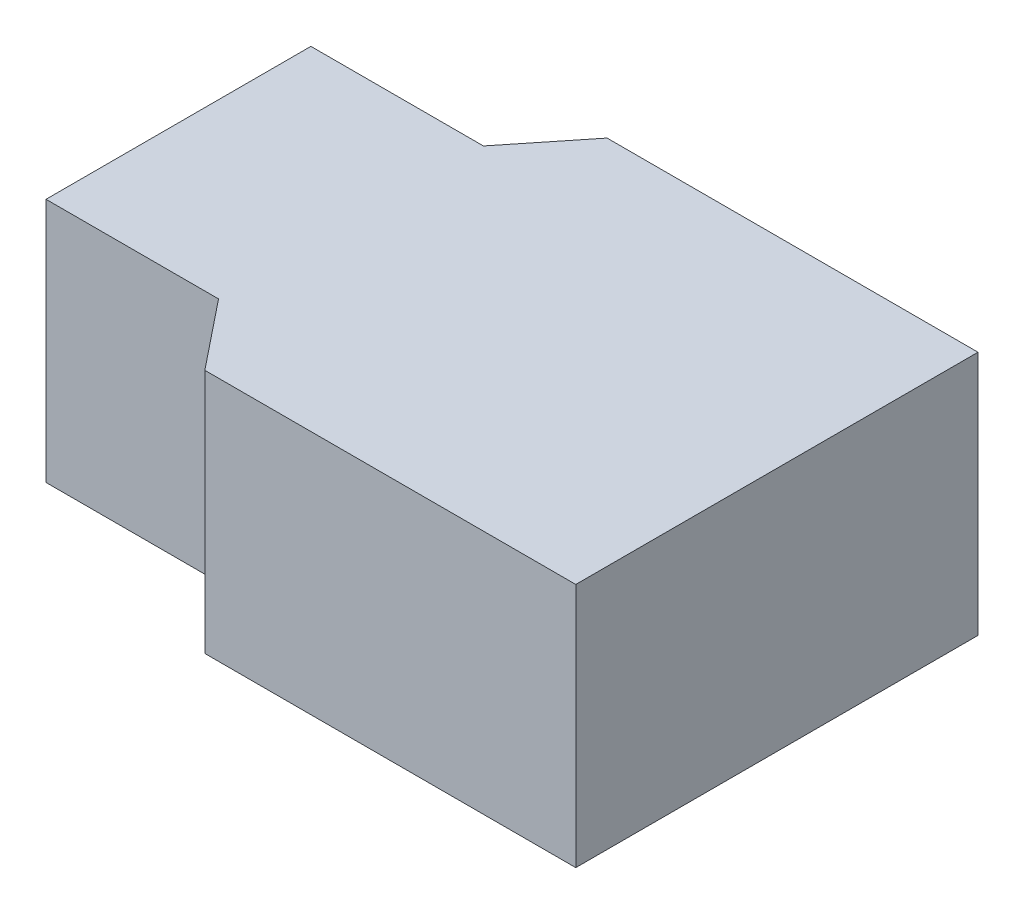
ISO-10303-21;
HEADER;
FILE_DESCRIPTION(('STEP AP214'),'2;1');
FILE_NAME('part.step','',(''),(''),'','','');
FILE_SCHEMA(('AUTOMOTIVE_DESIGN { 1 0 10303 214 1 1 1 1 }'));
ENDSEC;
DATA;
#1=APPLICATION_CONTEXT('core data for automotive mechanical design processes');
#2=APPLICATION_PROTOCOL_DEFINITION('international standard','automotive_design',2000,#1);
#3=PRODUCT_CONTEXT('',#1,'mechanical');
#4=PRODUCT('Part','Part','',(#3));
#5=PRODUCT_RELATED_PRODUCT_CATEGORY('part','',(#4));
#6=PRODUCT_DEFINITION_FORMATION('','',#4);
#7=PRODUCT_DEFINITION_CONTEXT('part definition',#1,'design');
#8=PRODUCT_DEFINITION('design','',#6,#7);
#9=PRODUCT_DEFINITION_SHAPE('','',#8);
#10=(LENGTH_UNIT() NAMED_UNIT(*) SI_UNIT(.MILLI.,.METRE.));
#11=(NAMED_UNIT(*) PLANE_ANGLE_UNIT() SI_UNIT($,.RADIAN.));
#12=(NAMED_UNIT(*) SI_UNIT($,.STERADIAN.) SOLID_ANGLE_UNIT());
#13=UNCERTAINTY_MEASURE_WITH_UNIT(LENGTH_MEASURE(1.E-05),#10,'distance_accuracy_value','');
#14=(GEOMETRIC_REPRESENTATION_CONTEXT(3) GLOBAL_UNCERTAINTY_ASSIGNED_CONTEXT((#13)) GLOBAL_UNIT_ASSIGNED_CONTEXT((#10,
#11,#12)) REPRESENTATION_CONTEXT('',''));
#15=CARTESIAN_POINT('',(0.,0.,0.));
#16=DIRECTION('',(0.,0.,1.));
#17=DIRECTION('',(1.,0.,0.));
#18=AXIS2_PLACEMENT_3D('',#15,#16,#17);
#19=CARTESIAN_POINT('',(-2.89809535584,0.,-2.11));
#20=DIRECTION('',(-0.780618364979066,0.,-0.625007974555053));
#21=DIRECTION('',(-0.625007974555053,0.,0.780618364979066));
#22=AXIS2_PLACEMENT_3D('',#19,#20,#21);
#23=PLANE('',#22);
#24=DIRECTION('',(0.,1.,0.));
#25=VECTOR('',#24,1.);
#26=CARTESIAN_POINT('',(-2.954141383172,0.,-2.04));
#27=LINE('',#26,#25);
#28=CARTESIAN_POINT('',(-2.954141383172,0.,-2.04));
#29=VERTEX_POINT('',#28);
#30=CARTESIAN_POINT('',(-2.954141383172,0.25,-2.04));
#31=VERTEX_POINT('',#30);
#32=EDGE_CURVE('E11',#29,#31,#27,.T.);
#33=ORIENTED_EDGE('',*,*,#32,.T.);
#34=DIRECTION('',(-0.625007974555053,0.,0.780618364979066));
#35=VECTOR('',#34,1.);
#36=CARTESIAN_POINT('',(-2.89809535584,0.25,-2.11));
#37=LINE('',#36,#35);
#38=CARTESIAN_POINT('',(-2.89809535584,0.25,-2.11));
#39=VERTEX_POINT('',#38);
#40=EDGE_CURVE('E25',#39,#31,#37,.T.);
#41=ORIENTED_EDGE('',*,*,#40,.F.);
#42=DIRECTION('',(0.,1.,0.));
#43=VECTOR('',#42,1.);
#44=CARTESIAN_POINT('',(-2.89809535584,0.,-2.11));
#45=LINE('',#44,#43);
#46=CARTESIAN_POINT('',(-2.89809535584,0.,-2.11));
#47=VERTEX_POINT('',#46);
#48=EDGE_CURVE('E99',#47,#39,#45,.T.);
#49=ORIENTED_EDGE('',*,*,#48,.F.);
#50=DIRECTION('',(-0.625007974555053,0.,0.780618364979066));
#51=VECTOR('',#50,1.);
#52=CARTESIAN_POINT('',(-2.89809535584,0.,-2.11));
#53=LINE('',#52,#51);
#54=EDGE_CURVE('E162',#47,#29,#53,.T.);
#55=ORIENTED_EDGE('',*,*,#54,.T.);
#56=EDGE_LOOP('',(#33,#41,#49,#55));
#57=FACE_BOUND('',#56,.T.);
#58=ADVANCED_FACE('F17',(#57),#23,.T.);
#59=CARTESIAN_POINT('',(0.,0.,0.));
#60=DIRECTION('',(0.,1.,0.));
#61=DIRECTION('',(1.,0.,0.));
#62=AXIS2_PLACEMENT_3D('',#59,#60,#61);
#63=PLANE('',#62);
#64=ORIENTED_EDGE('',*,*,#54,.F.);
#65=DIRECTION('',(-1.,0.,0.));
#66=VECTOR('',#65,1.);
#67=CARTESIAN_POINT('',(-2.52,0.,-2.11));
#68=LINE('',#67,#66);
#69=CARTESIAN_POINT('',(-2.52,0.,-2.11));
#70=VERTEX_POINT('',#69);
#71=EDGE_CURVE('E158',#70,#47,#68,.T.);
#72=ORIENTED_EDGE('',*,*,#71,.F.);
#73=DIRECTION('',(0.,0.,-1.));
#74=VECTOR('',#73,1.);
#75=CARTESIAN_POINT('',(-2.52,0.,-1.7));
#76=LINE('',#75,#74);
#77=CARTESIAN_POINT('',(-2.52,0.,-1.7));
#78=VERTEX_POINT('',#77);
#79=EDGE_CURVE('E93',#78,#70,#76,.T.);
#80=ORIENTED_EDGE('',*,*,#79,.F.);
#81=DIRECTION('',(1.,0.,0.));
#82=VECTOR('',#81,1.);
#83=CARTESIAN_POINT('',(-2.89809535584,0.,-1.7));
#84=LINE('',#83,#82);
#85=CARTESIAN_POINT('',(-2.89809535584,0.,-1.7));
#86=VERTEX_POINT('',#85);
#87=EDGE_CURVE('E150',#86,#78,#84,.T.);
#88=ORIENTED_EDGE('',*,*,#87,.F.);
#89=DIRECTION('',(0.625007974555053,0.,0.780618364979066));
#90=VECTOR('',#89,1.);
#91=CARTESIAN_POINT('',(-2.954141383172,0.,-1.77));
#92=LINE('',#91,#90);
#93=CARTESIAN_POINT('',(-2.954141383172,0.,-1.77));
#94=VERTEX_POINT('',#93);
#95=EDGE_CURVE('E145',#94,#86,#92,.T.);
#96=ORIENTED_EDGE('',*,*,#95,.F.);
#97=DIRECTION('',(1.,0.,0.));
#98=VECTOR('',#97,1.);
#99=CARTESIAN_POINT('',(-3.13,0.,-1.77));
#100=LINE('',#99,#98);
#101=CARTESIAN_POINT('',(-3.13,0.,-1.77));
#102=VERTEX_POINT('',#101);
#103=EDGE_CURVE('E140',#102,#94,#100,.T.);
#104=ORIENTED_EDGE('',*,*,#103,.F.);
#105=DIRECTION('',(0.,0.,1.));
#106=VECTOR('',#105,1.);
#107=CARTESIAN_POINT('',(-3.13,0.,-2.04));
#108=LINE('',#107,#106);
#109=CARTESIAN_POINT('',(-3.13,0.,-2.04));
#110=VERTEX_POINT('',#109);
#111=EDGE_CURVE('E135',#110,#102,#108,.T.);
#112=ORIENTED_EDGE('',*,*,#111,.F.);
#113=DIRECTION('',(-1.,0.,0.));
#114=VECTOR('',#113,1.);
#115=CARTESIAN_POINT('',(-2.954141383172,0.,-2.04));
#116=LINE('',#115,#114);
#117=EDGE_CURVE('E130',#29,#110,#116,.T.);
#118=ORIENTED_EDGE('',*,*,#117,.F.);
#119=EDGE_LOOP('',(#64,#72,#80,#88,#96,#104,#112,#118));
#120=FACE_BOUND('',#119,.T.);
#121=ADVANCED_FACE('F211',(#120),#63,.F.);
#122=CARTESIAN_POINT('',(-2.954141383172,0.,-2.04));
#123=DIRECTION('',(0.,0.,-1.));
#124=DIRECTION('',(-1.,0.,0.));
#125=AXIS2_PLACEMENT_3D('',#122,#123,#124);
#126=PLANE('',#125);
#127=DIRECTION('',(0.,1.,0.));
#128=VECTOR('',#127,1.);
#129=CARTESIAN_POINT('',(-3.13,0.,-2.04));
#130=LINE('',#129,#128);
#131=CARTESIAN_POINT('',(-3.13,0.25,-2.04));
#132=VERTEX_POINT('',#131);
#133=EDGE_CURVE('E126',#110,#132,#130,.T.);
#134=ORIENTED_EDGE('',*,*,#133,.T.);
#135=DIRECTION('',(-1.,0.,0.));
#136=VECTOR('',#135,1.);
#137=CARTESIAN_POINT('',(-2.954141383172,0.25,-2.04));
#138=LINE('',#137,#136);
#139=EDGE_CURVE('E121',#31,#132,#138,.T.);
#140=ORIENTED_EDGE('',*,*,#139,.F.);
#141=ORIENTED_EDGE('',*,*,#32,.F.);
#142=ORIENTED_EDGE('',*,*,#117,.T.);
#143=EDGE_LOOP('',(#134,#140,#141,#142));
#144=FACE_BOUND('',#143,.T.);
#145=ADVANCED_FACE('F176',(#144),#126,.T.);
#146=CARTESIAN_POINT('',(0.,0.25,0.));
#147=DIRECTION('',(0.,1.,0.));
#148=DIRECTION('',(1.,0.,0.));
#149=AXIS2_PLACEMENT_3D('',#146,#147,#148);
#150=PLANE('',#149);
#151=DIRECTION('',(0.,0.,1.));
#152=VECTOR('',#151,1.);
#153=CARTESIAN_POINT('',(-3.13,0.25,-2.04));
#154=LINE('',#153,#152);
#155=CARTESIAN_POINT('',(-3.13,0.25,-1.77));
#156=VERTEX_POINT('',#155);
#157=EDGE_CURVE('E117',#132,#156,#154,.T.);
#158=ORIENTED_EDGE('',*,*,#157,.T.);
#159=DIRECTION('',(1.,0.,0.));
#160=VECTOR('',#159,1.);
#161=CARTESIAN_POINT('',(-3.13,0.25,-1.77));
#162=LINE('',#161,#160);
#163=CARTESIAN_POINT('',(-2.954141383172,0.25,-1.77));
#164=VERTEX_POINT('',#163);
#165=EDGE_CURVE('E113',#156,#164,#162,.T.);
#166=ORIENTED_EDGE('',*,*,#165,.T.);
#167=DIRECTION('',(0.625007974555053,0.,0.780618364979066));
#168=VECTOR('',#167,1.);
#169=CARTESIAN_POINT('',(-2.954141383172,0.25,-1.77));
#170=LINE('',#169,#168);
#171=CARTESIAN_POINT('',(-2.89809535584,0.25,-1.7));
#172=VERTEX_POINT('',#171);
#173=EDGE_CURVE('E109',#164,#172,#170,.T.);
#174=ORIENTED_EDGE('',*,*,#173,.T.);
#175=DIRECTION('',(1.,0.,0.));
#176=VECTOR('',#175,1.);
#177=CARTESIAN_POINT('',(-2.89809535584,0.25,-1.7));
#178=LINE('',#177,#176);
#179=CARTESIAN_POINT('',(-2.52,0.25,-1.7));
#180=VERTEX_POINT('',#179);
#181=EDGE_CURVE('E84',#172,#180,#178,.T.);
#182=ORIENTED_EDGE('',*,*,#181,.T.);
#183=DIRECTION('',(0.,0.,-1.));
#184=VECTOR('',#183,1.);
#185=CARTESIAN_POINT('',(-2.52,0.25,-1.7));
#186=LINE('',#185,#184);
#187=CARTESIAN_POINT('',(-2.52,0.25,-2.11));
#188=VERTEX_POINT('',#187);
#189=EDGE_CURVE('E77',#180,#188,#186,.T.);
#190=ORIENTED_EDGE('',*,*,#189,.T.);
#191=DIRECTION('',(-1.,0.,0.));
#192=VECTOR('',#191,1.);
#193=CARTESIAN_POINT('',(-2.52,0.25,-2.11));
#194=LINE('',#193,#192);
#195=EDGE_CURVE('E81',#188,#39,#194,.T.);
#196=ORIENTED_EDGE('',*,*,#195,.T.);
#197=ORIENTED_EDGE('',*,*,#40,.T.);
#198=ORIENTED_EDGE('',*,*,#139,.T.);
#199=EDGE_LOOP('',(#158,#166,#174,#182,#190,#196,#197,#198));
#200=FACE_BOUND('',#199,.T.);
#201=ADVANCED_FACE('F79',(#200),#150,.T.);
#202=CARTESIAN_POINT('',(-2.52,0.,-2.11));
#203=DIRECTION('',(0.,0.,-1.));
#204=DIRECTION('',(-1.,0.,0.));
#205=AXIS2_PLACEMENT_3D('',#202,#203,#204);
#206=PLANE('',#205);
#207=ORIENTED_EDGE('',*,*,#48,.T.);
#208=ORIENTED_EDGE('',*,*,#195,.F.);
#209=DIRECTION('',(0.,1.,0.));
#210=VECTOR('',#209,1.);
#211=CARTESIAN_POINT('',(-2.52,0.,-2.11));
#212=LINE('',#211,#210);
#213=EDGE_CURVE('E91',#70,#188,#212,.T.);
#214=ORIENTED_EDGE('',*,*,#213,.F.);
#215=ORIENTED_EDGE('',*,*,#71,.T.);
#216=EDGE_LOOP('',(#207,#208,#214,#215));
#217=FACE_BOUND('',#216,.T.);
#218=ADVANCED_FACE('F98',(#217),#206,.T.);
#219=CARTESIAN_POINT('',(-2.52,0.,-1.7));
#220=DIRECTION('',(1.,0.,0.));
#221=DIRECTION('',(0.,0.,-1.));
#222=AXIS2_PLACEMENT_3D('',#219,#220,#221);
#223=PLANE('',#222);
#224=ORIENTED_EDGE('',*,*,#213,.T.);
#225=ORIENTED_EDGE('',*,*,#189,.F.);
#226=DIRECTION('',(0.,1.,0.));
#227=VECTOR('',#226,1.);
#228=CARTESIAN_POINT('',(-2.52,0.,-1.7));
#229=LINE('',#228,#227);
#230=EDGE_CURVE('E96',#78,#180,#229,.T.);
#231=ORIENTED_EDGE('',*,*,#230,.F.);
#232=ORIENTED_EDGE('',*,*,#79,.T.);
#233=EDGE_LOOP('',(#224,#225,#231,#232));
#234=FACE_BOUND('',#233,.T.);
#235=ADVANCED_FACE('F92',(#234),#223,.T.);
#236=CARTESIAN_POINT('',(-2.89809535584,0.,-1.7));
#237=DIRECTION('',(0.,0.,1.));
#238=DIRECTION('',(1.,0.,0.));
#239=AXIS2_PLACEMENT_3D('',#236,#237,#238);
#240=PLANE('',#239);
#241=ORIENTED_EDGE('',*,*,#230,.T.);
#242=ORIENTED_EDGE('',*,*,#181,.F.);
#243=DIRECTION('',(0.,1.,0.));
#244=VECTOR('',#243,1.);
#245=CARTESIAN_POINT('',(-2.89809535584,0.,-1.7));
#246=LINE('',#245,#244);
#247=EDGE_CURVE('E194',#86,#172,#246,.T.);
#248=ORIENTED_EDGE('',*,*,#247,.F.);
#249=ORIENTED_EDGE('',*,*,#87,.T.);
#250=EDGE_LOOP('',(#241,#242,#248,#249));
#251=FACE_BOUND('',#250,.T.);
#252=ADVANCED_FACE('F198',(#251),#240,.T.);
#253=CARTESIAN_POINT('',(-2.954141383172,0.,-1.77));
#254=DIRECTION('',(-0.780618364979066,0.,0.625007974555053));
#255=DIRECTION('',(0.625007974555053,0.,0.780618364979066));
#256=AXIS2_PLACEMENT_3D('',#253,#254,#255);
#257=PLANE('',#256);
#258=ORIENTED_EDGE('',*,*,#247,.T.);
#259=ORIENTED_EDGE('',*,*,#173,.F.);
#260=DIRECTION('',(0.,1.,0.));
#261=VECTOR('',#260,1.);
#262=CARTESIAN_POINT('',(-2.954141383172,0.,-1.77));
#263=LINE('',#262,#261);
#264=EDGE_CURVE('E185',#94,#164,#263,.T.);
#265=ORIENTED_EDGE('',*,*,#264,.F.);
#266=ORIENTED_EDGE('',*,*,#95,.T.);
#267=EDGE_LOOP('',(#258,#259,#265,#266));
#268=FACE_BOUND('',#267,.T.);
#269=ADVANCED_FACE('F195',(#268),#257,.T.);
#270=CARTESIAN_POINT('',(-3.13,0.,-1.77));
#271=DIRECTION('',(0.,0.,1.));
#272=DIRECTION('',(1.,0.,0.));
#273=AXIS2_PLACEMENT_3D('',#270,#271,#272);
#274=PLANE('',#273);
#275=ORIENTED_EDGE('',*,*,#264,.T.);
#276=ORIENTED_EDGE('',*,*,#165,.F.);
#277=DIRECTION('',(0.,1.,0.));
#278=VECTOR('',#277,1.);
#279=CARTESIAN_POINT('',(-3.13,0.,-1.77));
#280=LINE('',#279,#278);
#281=EDGE_CURVE('E182',#102,#156,#280,.T.);
#282=ORIENTED_EDGE('',*,*,#281,.F.);
#283=ORIENTED_EDGE('',*,*,#103,.T.);
#284=EDGE_LOOP('',(#275,#276,#282,#283));
#285=FACE_BOUND('',#284,.T.);
#286=ADVANCED_FACE('F188',(#285),#274,.T.);
#287=CARTESIAN_POINT('',(-3.13,0.,-2.04));
#288=DIRECTION('',(-1.,0.,0.));
#289=DIRECTION('',(0.,0.,1.));
#290=AXIS2_PLACEMENT_3D('',#287,#288,#289);
#291=PLANE('',#290);
#292=ORIENTED_EDGE('',*,*,#281,.T.);
#293=ORIENTED_EDGE('',*,*,#157,.F.);
#294=ORIENTED_EDGE('',*,*,#133,.F.);
#295=ORIENTED_EDGE('',*,*,#111,.T.);
#296=EDGE_LOOP('',(#292,#293,#294,#295));
#297=FACE_BOUND('',#296,.T.);
#298=ADVANCED_FACE('F180',(#297),#291,.T.);
#299=CLOSED_SHELL('',(#58,#121,#145,#201,#218,#235,#252,#269,#286,#298));
#300=MANIFOLD_SOLID_BREP('B1',#299);
#301=ADVANCED_BREP_SHAPE_REPRESENTATION('',(#18,#300),#14);
#302=SHAPE_DEFINITION_REPRESENTATION(#9,#301);
ENDSEC;
END-ISO-10303-21;
